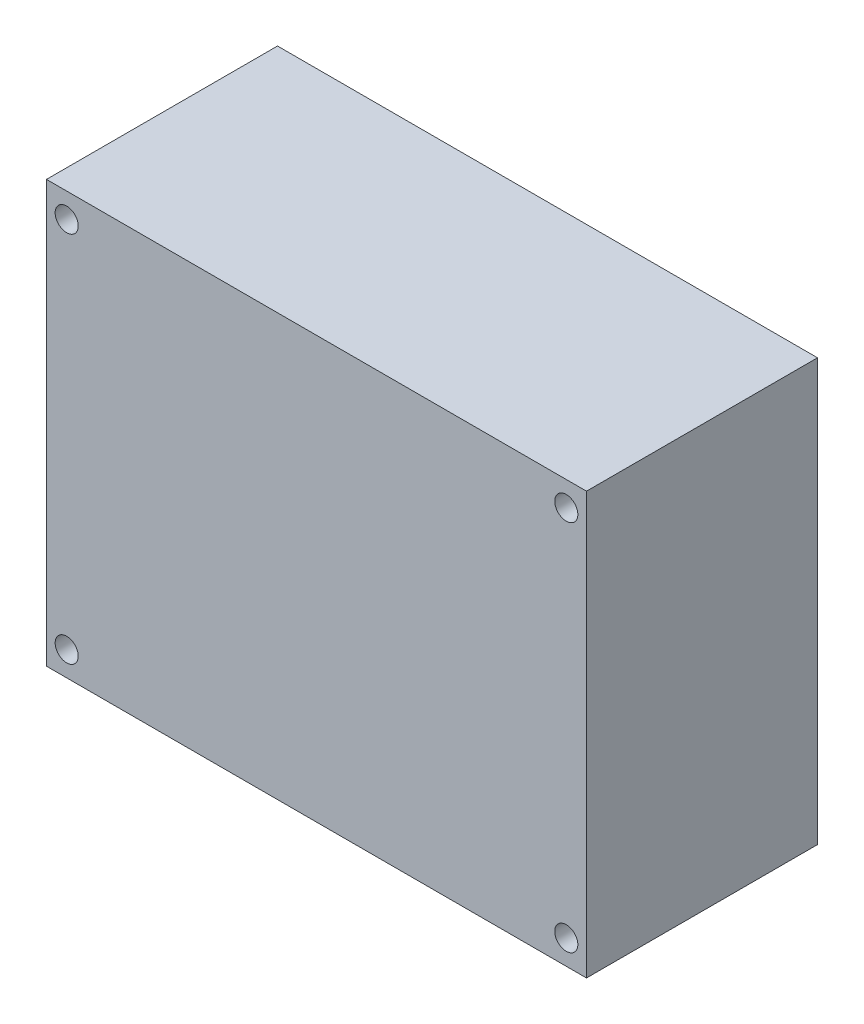
ISO-10303-21;
HEADER;
FILE_DESCRIPTION(('STEP AP214'),'2;1');
FILE_NAME('part.step','',(''),(''),'','','');
FILE_SCHEMA(('AUTOMOTIVE_DESIGN { 1 0 10303 214 1 1 1 1 }'));
ENDSEC;
DATA;
#1=APPLICATION_CONTEXT('core data for automotive mechanical design processes');
#2=APPLICATION_PROTOCOL_DEFINITION('international standard','automotive_design',2000,#1);
#3=PRODUCT_CONTEXT('',#1,'mechanical');
#4=PRODUCT('Part','Part','',(#3));
#5=PRODUCT_RELATED_PRODUCT_CATEGORY('part','',(#4));
#6=PRODUCT_DEFINITION_FORMATION('','',#4);
#7=PRODUCT_DEFINITION_CONTEXT('part definition',#1,'design');
#8=PRODUCT_DEFINITION('design','',#6,#7);
#9=PRODUCT_DEFINITION_SHAPE('','',#8);
#10=(LENGTH_UNIT() NAMED_UNIT(*) SI_UNIT(.MILLI.,.METRE.));
#11=(NAMED_UNIT(*) PLANE_ANGLE_UNIT() SI_UNIT($,.RADIAN.));
#12=(NAMED_UNIT(*) SI_UNIT($,.STERADIAN.) SOLID_ANGLE_UNIT());
#13=UNCERTAINTY_MEASURE_WITH_UNIT(LENGTH_MEASURE(1.E-05),#10,'distance_accuracy_value','');
#14=(GEOMETRIC_REPRESENTATION_CONTEXT(3) GLOBAL_UNCERTAINTY_ASSIGNED_CONTEXT((#13)) GLOBAL_UNIT_ASSIGNED_CONTEXT((#10,
#11,#12)) REPRESENTATION_CONTEXT('',''));
#15=CARTESIAN_POINT('',(0.,0.,0.));
#16=DIRECTION('',(0.,0.,1.));
#17=DIRECTION('',(1.,0.,0.));
#18=AXIS2_PLACEMENT_3D('',#15,#16,#17);
#19=CARTESIAN_POINT('',(46.75,36.5,40.));
#20=DIRECTION('',(-1.,0.,0.));
#21=DIRECTION('',(0.,-1.,0.));
#22=AXIS2_PLACEMENT_3D('',#19,#20,#21);
#23=PLANE('',#22);
#24=DIRECTION('',(0.,1.,0.));
#25=VECTOR('',#24,1.);
#26=CARTESIAN_POINT('',(46.75,36.5,0.));
#27=LINE('',#26,#25);
#28=CARTESIAN_POINT('',(46.75,-36.5,0.));
#29=VERTEX_POINT('',#28);
#30=CARTESIAN_POINT('',(46.75,36.5,0.));
#31=VERTEX_POINT('',#30);
#32=EDGE_CURVE('E98',#29,#31,#27,.T.);
#33=ORIENTED_EDGE('',*,*,#32,.T.);
#34=DIRECTION('',(0.,0.,-1.));
#35=VECTOR('',#34,1.);
#36=CARTESIAN_POINT('',(46.75,36.5,40.));
#37=LINE('',#36,#35);
#38=CARTESIAN_POINT('',(46.75,36.5,40.));
#39=VERTEX_POINT('',#38);
#40=EDGE_CURVE('E11',#39,#31,#37,.T.);
#41=ORIENTED_EDGE('',*,*,#40,.F.);
#42=DIRECTION('',(0.,1.,0.));
#43=VECTOR('',#42,1.);
#44=CARTESIAN_POINT('',(46.75,36.5,40.));
#45=LINE('',#44,#43);
#46=CARTESIAN_POINT('',(46.75,-36.5,40.));
#47=VERTEX_POINT('',#46);
#48=EDGE_CURVE('E86',#47,#39,#45,.T.);
#49=ORIENTED_EDGE('',*,*,#48,.F.);
#50=DIRECTION('',(0.,0.,-1.));
#51=VECTOR('',#50,1.);
#52=CARTESIAN_POINT('',(46.75,-36.5,40.));
#53=LINE('',#52,#51);
#54=EDGE_CURVE('E94',#47,#29,#53,.T.);
#55=ORIENTED_EDGE('',*,*,#54,.T.);
#56=EDGE_LOOP('',(#33,#41,#49,#55));
#57=FACE_BOUND('',#56,.T.);
#58=ADVANCED_FACE('F35',(#57),#23,.F.);
#59=CARTESIAN_POINT('',(-46.75,36.5,40.));
#60=DIRECTION('',(0.,-1.,0.));
#61=DIRECTION('',(0.,0.,-1.));
#62=AXIS2_PLACEMENT_3D('',#59,#60,#61);
#63=PLANE('',#62);
#64=DIRECTION('',(-1.,0.,0.));
#65=VECTOR('',#64,1.);
#66=CARTESIAN_POINT('',(-46.75,36.5,0.));
#67=LINE('',#66,#65);
#68=CARTESIAN_POINT('',(-46.75,36.5,0.));
#69=VERTEX_POINT('',#68);
#70=EDGE_CURVE('E90',#31,#69,#67,.T.);
#71=ORIENTED_EDGE('',*,*,#70,.T.);
#72=DIRECTION('',(0.,0.,-1.));
#73=VECTOR('',#72,1.);
#74=CARTESIAN_POINT('',(-46.75,36.5,40.));
#75=LINE('',#74,#73);
#76=CARTESIAN_POINT('',(-46.75,36.5,40.));
#77=VERTEX_POINT('',#76);
#78=EDGE_CURVE('E43',#77,#69,#75,.T.);
#79=ORIENTED_EDGE('',*,*,#78,.F.);
#80=DIRECTION('',(-1.,0.,0.));
#81=VECTOR('',#80,1.);
#82=CARTESIAN_POINT('',(-46.75,36.5,40.));
#83=LINE('',#82,#81);
#84=EDGE_CURVE('E81',#39,#77,#83,.T.);
#85=ORIENTED_EDGE('',*,*,#84,.F.);
#86=ORIENTED_EDGE('',*,*,#40,.T.);
#87=EDGE_LOOP('',(#71,#79,#85,#86));
#88=FACE_BOUND('',#87,.T.);
#89=ADVANCED_FACE('F89',(#88),#63,.F.);
#90=CARTESIAN_POINT('',(-46.75,36.5,40.));
#91=DIRECTION('',(1.,0.,0.));
#92=DIRECTION('',(0.,1.,0.));
#93=AXIS2_PLACEMENT_3D('',#90,#91,#92);
#94=PLANE('',#93);
#95=DIRECTION('',(0.,-1.,0.));
#96=VECTOR('',#95,1.);
#97=CARTESIAN_POINT('',(-46.75,36.5,0.));
#98=LINE('',#97,#96);
#99=CARTESIAN_POINT('',(-46.75,-36.5,0.));
#100=VERTEX_POINT('',#99);
#101=EDGE_CURVE('E68',#69,#100,#98,.T.);
#102=ORIENTED_EDGE('',*,*,#101,.T.);
#103=DIRECTION('',(0.,0.,-1.));
#104=VECTOR('',#103,1.);
#105=CARTESIAN_POINT('',(-46.75,-36.5,40.));
#106=LINE('',#105,#104);
#107=CARTESIAN_POINT('',(-46.75,-36.5,40.));
#108=VERTEX_POINT('',#107);
#109=EDGE_CURVE('E91',#108,#100,#106,.T.);
#110=ORIENTED_EDGE('',*,*,#109,.F.);
#111=DIRECTION('',(0.,-1.,0.));
#112=VECTOR('',#111,1.);
#113=CARTESIAN_POINT('',(-46.75,36.5,40.));
#114=LINE('',#113,#112);
#115=EDGE_CURVE('E84',#77,#108,#114,.T.);
#116=ORIENTED_EDGE('',*,*,#115,.F.);
#117=ORIENTED_EDGE('',*,*,#78,.T.);
#118=EDGE_LOOP('',(#102,#110,#116,#117));
#119=FACE_BOUND('',#118,.T.);
#120=ADVANCED_FACE('F92',(#119),#94,.F.);
#121=CARTESIAN_POINT('',(-46.75,-36.5,40.));
#122=DIRECTION('',(0.,1.,0.));
#123=DIRECTION('',(0.,0.,1.));
#124=AXIS2_PLACEMENT_3D('',#121,#122,#123);
#125=PLANE('',#124);
#126=DIRECTION('',(1.,0.,0.));
#127=VECTOR('',#126,1.);
#128=CARTESIAN_POINT('',(-46.75,-36.5,0.));
#129=LINE('',#128,#127);
#130=EDGE_CURVE('E74',#100,#29,#129,.T.);
#131=ORIENTED_EDGE('',*,*,#130,.T.);
#132=ORIENTED_EDGE('',*,*,#54,.F.);
#133=DIRECTION('',(1.,0.,0.));
#134=VECTOR('',#133,1.);
#135=CARTESIAN_POINT('',(-46.75,-36.5,40.));
#136=LINE('',#135,#134);
#137=EDGE_CURVE('E51',#108,#47,#136,.T.);
#138=ORIENTED_EDGE('',*,*,#137,.F.);
#139=ORIENTED_EDGE('',*,*,#109,.T.);
#140=EDGE_LOOP('',(#131,#132,#138,#139));
#141=FACE_BOUND('',#140,.T.);
#142=ADVANCED_FACE('F106',(#141),#125,.F.);
#143=CARTESIAN_POINT('',(0.,0.,40.));
#144=DIRECTION('',(0.,0.,1.));
#145=DIRECTION('',(1.,0.,0.));
#146=AXIS2_PLACEMENT_3D('',#143,#144,#145);
#147=PLANE('',#146);
#148=CARTESIAN_POINT('',(43.25,32.25,40.));
#149=DIRECTION('',(0.,0.,1.));
#150=DIRECTION('',(1.,0.,0.));
#151=AXIS2_PLACEMENT_3D('',#148,#149,#150);
#152=CIRCLE('',#151,2.);
#153=CARTESIAN_POINT('',(45.25,32.25,40.));
#154=VERTEX_POINT('',#153);
#155=EDGE_CURVE('E130',#154,#154,#152,.T.);
#156=ORIENTED_EDGE('',*,*,#155,.F.);
#157=EDGE_LOOP('',(#156));
#158=FACE_BOUND('',#157,.T.);
#159=CARTESIAN_POINT('',(43.25,-32.25,40.));
#160=DIRECTION('',(0.,0.,1.));
#161=DIRECTION('',(1.,0.,0.));
#162=AXIS2_PLACEMENT_3D('',#159,#160,#161);
#163=CIRCLE('',#162,2.);
#164=CARTESIAN_POINT('',(45.25,-32.25,40.));
#165=VERTEX_POINT('',#164);
#166=EDGE_CURVE('E124',#165,#165,#163,.T.);
#167=ORIENTED_EDGE('',*,*,#166,.F.);
#168=EDGE_LOOP('',(#167));
#169=FACE_BOUND('',#168,.T.);
#170=CARTESIAN_POINT('',(-43.25,-32.25,40.));
#171=DIRECTION('',(0.,0.,1.));
#172=DIRECTION('',(1.,0.,0.));
#173=AXIS2_PLACEMENT_3D('',#170,#171,#172);
#174=CIRCLE('',#173,2.);
#175=CARTESIAN_POINT('',(-41.25,-32.25,40.));
#176=VERTEX_POINT('',#175);
#177=EDGE_CURVE('E118',#176,#176,#174,.T.);
#178=ORIENTED_EDGE('',*,*,#177,.F.);
#179=EDGE_LOOP('',(#178));
#180=FACE_BOUND('',#179,.T.);
#181=CARTESIAN_POINT('',(-43.25,32.25,40.));
#182=DIRECTION('',(0.,0.,1.));
#183=DIRECTION('',(1.,0.,0.));
#184=AXIS2_PLACEMENT_3D('',#181,#182,#183);
#185=CIRCLE('',#184,2.);
#186=CARTESIAN_POINT('',(-41.25,32.25,40.));
#187=VERTEX_POINT('',#186);
#188=EDGE_CURVE('E112',#187,#187,#185,.T.);
#189=ORIENTED_EDGE('',*,*,#188,.F.);
#190=EDGE_LOOP('',(#189));
#191=FACE_BOUND('',#190,.T.);
#192=ORIENTED_EDGE('',*,*,#48,.T.);
#193=ORIENTED_EDGE('',*,*,#84,.T.);
#194=ORIENTED_EDGE('',*,*,#115,.T.);
#195=ORIENTED_EDGE('',*,*,#137,.T.);
#196=EDGE_LOOP('',(#192,#193,#194,#195));
#197=FACE_BOUND('',#196,.T.);
#198=ADVANCED_FACE('F82',(#158,#169,#180,#191,#197),#147,.T.);
#199=CARTESIAN_POINT('',(0.,0.,0.));
#200=DIRECTION('',(0.,0.,1.));
#201=DIRECTION('',(1.,0.,0.));
#202=AXIS2_PLACEMENT_3D('',#199,#200,#201);
#203=PLANE('',#202);
#204=CARTESIAN_POINT('',(43.25,32.25,0.));
#205=DIRECTION('',(0.,0.,1.));
#206=DIRECTION('',(1.,0.,0.));
#207=AXIS2_PLACEMENT_3D('',#204,#205,#206);
#208=CIRCLE('',#207,2.);
#209=CARTESIAN_POINT('',(45.25,32.25,0.));
#210=VERTEX_POINT('',#209);
#211=EDGE_CURVE('E115',#210,#210,#208,.T.);
#212=ORIENTED_EDGE('',*,*,#211,.T.);
#213=EDGE_LOOP('',(#212));
#214=FACE_BOUND('',#213,.T.);
#215=CARTESIAN_POINT('',(43.25,-32.25,0.));
#216=DIRECTION('',(0.,0.,1.));
#217=DIRECTION('',(1.,0.,0.));
#218=AXIS2_PLACEMENT_3D('',#215,#216,#217);
#219=CIRCLE('',#218,2.);
#220=CARTESIAN_POINT('',(45.25,-32.25,0.));
#221=VERTEX_POINT('',#220);
#222=EDGE_CURVE('E127',#221,#221,#219,.T.);
#223=ORIENTED_EDGE('',*,*,#222,.T.);
#224=EDGE_LOOP('',(#223));
#225=FACE_BOUND('',#224,.T.);
#226=CARTESIAN_POINT('',(-43.25,-32.25,0.));
#227=DIRECTION('',(0.,0.,1.));
#228=DIRECTION('',(1.,0.,0.));
#229=AXIS2_PLACEMENT_3D('',#226,#227,#228);
#230=CIRCLE('',#229,2.);
#231=CARTESIAN_POINT('',(-41.25,-32.25,0.));
#232=VERTEX_POINT('',#231);
#233=EDGE_CURVE('E121',#232,#232,#230,.T.);
#234=ORIENTED_EDGE('',*,*,#233,.T.);
#235=EDGE_LOOP('',(#234));
#236=FACE_BOUND('',#235,.T.);
#237=CARTESIAN_POINT('',(-43.25,32.25,0.));
#238=DIRECTION('',(0.,0.,1.));
#239=DIRECTION('',(1.,0.,0.));
#240=AXIS2_PLACEMENT_3D('',#237,#238,#239);
#241=CIRCLE('',#240,2.);
#242=CARTESIAN_POINT('',(-41.25,32.25,0.));
#243=VERTEX_POINT('',#242);
#244=EDGE_CURVE('E101',#243,#243,#241,.T.);
#245=ORIENTED_EDGE('',*,*,#244,.T.);
#246=EDGE_LOOP('',(#245));
#247=FACE_BOUND('',#246,.T.);
#248=ORIENTED_EDGE('',*,*,#32,.F.);
#249=ORIENTED_EDGE('',*,*,#130,.F.);
#250=ORIENTED_EDGE('',*,*,#101,.F.);
#251=ORIENTED_EDGE('',*,*,#70,.F.);
#252=EDGE_LOOP('',(#248,#249,#250,#251));
#253=FACE_BOUND('',#252,.T.);
#254=ADVANCED_FACE('F109',(#214,#225,#236,#247,#253),#203,.F.);
#255=CARTESIAN_POINT('',(-43.25,32.25,0.));
#256=DIRECTION('',(0.,0.,1.));
#257=DIRECTION('',(1.,0.,0.));
#258=AXIS2_PLACEMENT_3D('',#255,#256,#257);
#259=CYLINDRICAL_SURFACE('',#258,2.);
#260=ORIENTED_EDGE('',*,*,#244,.F.);
#261=EDGE_LOOP('',(#260));
#262=FACE_BOUND('',#261,.T.);
#263=ORIENTED_EDGE('',*,*,#188,.T.);
#264=EDGE_LOOP('',(#263));
#265=FACE_BOUND('',#264,.T.);
#266=ADVANCED_FACE('F154',(#262,#265),#259,.F.);
#267=CARTESIAN_POINT('',(-43.25,-32.25,0.));
#268=DIRECTION('',(0.,0.,1.));
#269=DIRECTION('',(1.,0.,0.));
#270=AXIS2_PLACEMENT_3D('',#267,#268,#269);
#271=CYLINDRICAL_SURFACE('',#270,2.);
#272=ORIENTED_EDGE('',*,*,#233,.F.);
#273=EDGE_LOOP('',(#272));
#274=FACE_BOUND('',#273,.T.);
#275=ORIENTED_EDGE('',*,*,#177,.T.);
#276=EDGE_LOOP('',(#275));
#277=FACE_BOUND('',#276,.T.);
#278=ADVANCED_FACE('F156',(#274,#277),#271,.F.);
#279=CARTESIAN_POINT('',(43.25,-32.25,0.));
#280=DIRECTION('',(0.,0.,1.));
#281=DIRECTION('',(1.,0.,0.));
#282=AXIS2_PLACEMENT_3D('',#279,#280,#281);
#283=CYLINDRICAL_SURFACE('',#282,2.);
#284=ORIENTED_EDGE('',*,*,#222,.F.);
#285=EDGE_LOOP('',(#284));
#286=FACE_BOUND('',#285,.T.);
#287=ORIENTED_EDGE('',*,*,#166,.T.);
#288=EDGE_LOOP('',(#287));
#289=FACE_BOUND('',#288,.T.);
#290=ADVANCED_FACE('F141',(#286,#289),#283,.F.);
#291=CARTESIAN_POINT('',(43.25,32.25,0.));
#292=DIRECTION('',(0.,0.,1.));
#293=DIRECTION('',(1.,0.,0.));
#294=AXIS2_PLACEMENT_3D('',#291,#292,#293);
#295=CYLINDRICAL_SURFACE('',#294,2.);
#296=ORIENTED_EDGE('',*,*,#211,.F.);
#297=EDGE_LOOP('',(#296));
#298=FACE_BOUND('',#297,.T.);
#299=ORIENTED_EDGE('',*,*,#155,.T.);
#300=EDGE_LOOP('',(#299));
#301=FACE_BOUND('',#300,.T.);
#302=ADVANCED_FACE('F138',(#298,#301),#295,.F.);
#303=CLOSED_SHELL('',(#58,#89,#120,#142,#198,#254,#266,#278,#290,#302));
#304=MANIFOLD_SOLID_BREP('B2',#303);
#305=ADVANCED_BREP_SHAPE_REPRESENTATION('',(#18,#304),#14);
#306=SHAPE_DEFINITION_REPRESENTATION(#9,#305);
ENDSEC;
END-ISO-10303-21;
